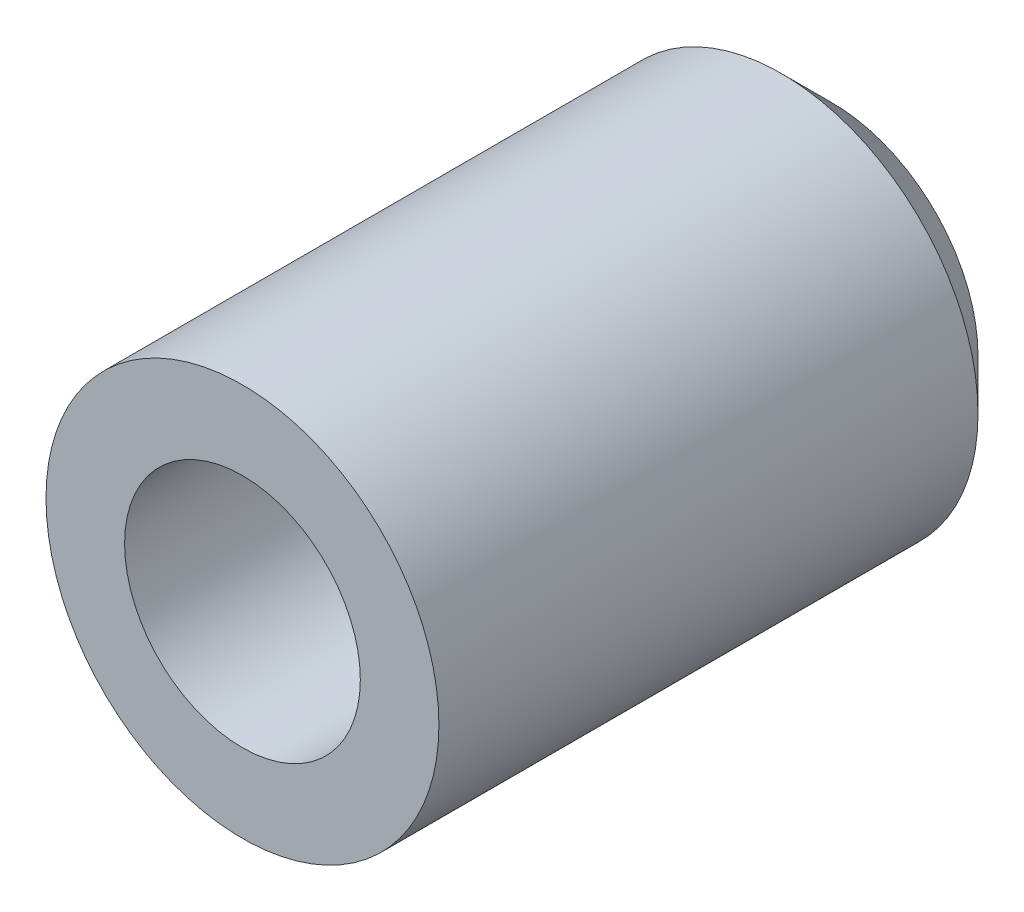
ISO-10303-21;
HEADER;
FILE_DESCRIPTION(('STEP AP214'),'2;1');
FILE_NAME('part.step','',(''),(''),'','','');
FILE_SCHEMA(('AUTOMOTIVE_DESIGN { 1 0 10303 214 1 1 1 1 }'));
ENDSEC;
DATA;
#1=APPLICATION_CONTEXT('core data for automotive mechanical design processes');
#2=APPLICATION_PROTOCOL_DEFINITION('international standard','automotive_design',2000,#1);
#3=PRODUCT_CONTEXT('',#1,'mechanical');
#4=PRODUCT('Part','Part','',(#3));
#5=PRODUCT_RELATED_PRODUCT_CATEGORY('part','',(#4));
#6=PRODUCT_DEFINITION_FORMATION('','',#4);
#7=PRODUCT_DEFINITION_CONTEXT('part definition',#1,'design');
#8=PRODUCT_DEFINITION('design','',#6,#7);
#9=PRODUCT_DEFINITION_SHAPE('','',#8);
#10=(LENGTH_UNIT() NAMED_UNIT(*) SI_UNIT(.MILLI.,.METRE.));
#11=(NAMED_UNIT(*) PLANE_ANGLE_UNIT() SI_UNIT($,.RADIAN.));
#12=(NAMED_UNIT(*) SI_UNIT($,.STERADIAN.) SOLID_ANGLE_UNIT());
#13=UNCERTAINTY_MEASURE_WITH_UNIT(LENGTH_MEASURE(1.E-05),#10,'distance_accuracy_value','');
#14=(GEOMETRIC_REPRESENTATION_CONTEXT(3) GLOBAL_UNCERTAINTY_ASSIGNED_CONTEXT((#13)) GLOBAL_UNIT_ASSIGNED_CONTEXT((#10,
#11,#12)) REPRESENTATION_CONTEXT('',''));
#15=CARTESIAN_POINT('',(0.,0.,0.));
#16=DIRECTION('',(0.,0.,1.));
#17=DIRECTION('',(1.,0.,0.));
#18=AXIS2_PLACEMENT_3D('',#15,#16,#17);
#19=CARTESIAN_POINT('',(0.,0.,11.90625));
#20=DIRECTION('',(0.,0.,1.));
#21=DIRECTION('',(1.,0.,0.));
#22=AXIS2_PLACEMENT_3D('',#19,#20,#21);
#23=PLANE('',#22);
#24=CARTESIAN_POINT('',(0.,0.,11.90625));
#25=DIRECTION('',(0.,0.,1.));
#26=DIRECTION('',(1.,0.,0.));
#27=AXIS2_PLACEMENT_3D('',#24,#25,#26);
#28=CIRCLE('',#27,7.9375);
#29=CARTESIAN_POINT('',(7.9375,0.,11.90625));
#30=VERTEX_POINT('',#29);
#31=EDGE_CURVE('E42',#30,#30,#28,.T.);
#32=ORIENTED_EDGE('',*,*,#31,.T.);
#33=EDGE_LOOP('',(#32));
#34=FACE_BOUND('',#33,.T.);
#35=CARTESIAN_POINT('',(0.,0.,11.90625));
#36=DIRECTION('',(0.,0.,1.));
#37=DIRECTION('',(1.,0.,0.));
#38=AXIS2_PLACEMENT_3D('',#35,#36,#37);
#39=CIRCLE('',#38,4.7625);
#40=CARTESIAN_POINT('',(4.7625,0.,11.90625));
#41=VERTEX_POINT('',#40);
#42=EDGE_CURVE('E46',#41,#41,#39,.T.);
#43=ORIENTED_EDGE('',*,*,#42,.F.);
#44=EDGE_LOOP('',(#43));
#45=FACE_BOUND('',#44,.T.);
#46=ADVANCED_FACE('F31',(#34,#45),#23,.T.);
#47=CARTESIAN_POINT('',(0.,0.,-11.90625));
#48=DIRECTION('',(0.,0.,1.));
#49=DIRECTION('',(1.,0.,0.));
#50=AXIS2_PLACEMENT_3D('',#47,#48,#49);
#51=PLANE('',#50);
#52=CARTESIAN_POINT('',(0.,0.,-11.90625));
#53=DIRECTION('',(0.,0.,1.));
#54=DIRECTION('',(1.,0.,0.));
#55=AXIS2_PLACEMENT_3D('',#52,#53,#54);
#56=CIRCLE('',#55,5.90549999999999);
#57=CARTESIAN_POINT('',(5.90549999999999,0.,-11.90625));
#58=VERTEX_POINT('',#57);
#59=EDGE_CURVE('E10',#58,#58,#56,.F.);
#60=ORIENTED_EDGE('',*,*,#59,.T.);
#61=EDGE_LOOP('',(#60));
#62=FACE_BOUND('',#61,.T.);
#63=CARTESIAN_POINT('',(0.,0.,-11.90625));
#64=DIRECTION('',(0.,0.,1.));
#65=DIRECTION('',(1.,0.,0.));
#66=AXIS2_PLACEMENT_3D('',#63,#64,#65);
#67=CIRCLE('',#66,4.7625);
#68=CARTESIAN_POINT('',(4.7625,0.,-11.90625));
#69=VERTEX_POINT('',#68);
#70=EDGE_CURVE('E49',#69,#69,#67,.T.);
#71=ORIENTED_EDGE('',*,*,#70,.T.);
#72=EDGE_LOOP('',(#71));
#73=FACE_BOUND('',#72,.T.);
#74=ADVANCED_FACE('F59',(#62,#73),#51,.F.);
#75=CARTESIAN_POINT('',(0.,0.,11.90625));
#76=DIRECTION('',(0.,0.,-1.));
#77=DIRECTION('',(-1.,0.,0.));
#78=AXIS2_PLACEMENT_3D('',#75,#76,#77);
#79=CYLINDRICAL_SURFACE('',#78,7.9375);
#80=CARTESIAN_POINT('',(0.,0.,-9.87425));
#81=DIRECTION('',(0.,0.,1.));
#82=DIRECTION('',(1.,0.,0.));
#83=AXIS2_PLACEMENT_3D('',#80,#81,#82);
#84=CIRCLE('',#83,7.9375);
#85=CARTESIAN_POINT('',(7.9375,0.,-9.87425));
#86=VERTEX_POINT('',#85);
#87=EDGE_CURVE('E38',#86,#86,#84,.T.);
#88=ORIENTED_EDGE('',*,*,#87,.T.);
#89=EDGE_LOOP('',(#88));
#90=FACE_BOUND('',#89,.T.);
#91=ORIENTED_EDGE('',*,*,#31,.F.);
#92=EDGE_LOOP('',(#91));
#93=FACE_BOUND('',#92,.T.);
#94=ADVANCED_FACE('F65',(#90,#93),#79,.T.);
#95=CARTESIAN_POINT('',(0.,0.,11.90625));
#96=DIRECTION('',(0.,0.,-1.));
#97=DIRECTION('',(-1.,0.,0.));
#98=AXIS2_PLACEMENT_3D('',#95,#96,#97);
#99=CYLINDRICAL_SURFACE('',#98,4.7625);
#100=ORIENTED_EDGE('',*,*,#42,.T.);
#101=EDGE_LOOP('',(#100));
#102=FACE_BOUND('',#101,.T.);
#103=ORIENTED_EDGE('',*,*,#70,.F.);
#104=EDGE_LOOP('',(#103));
#105=FACE_BOUND('',#104,.T.);
#106=ADVANCED_FACE('F55',(#102,#105),#99,.F.);
#107=CARTESIAN_POINT('',(0.,0.,-9.87425));
#108=DIRECTION('',(0.,0.,1.));
#109=DIRECTION('',(1.,0.,0.));
#110=AXIS2_PLACEMENT_3D('',#107,#108,#109);
#111=CONICAL_SURFACE('',#110,7.9375,0.78539816339745);
#112=ORIENTED_EDGE('',*,*,#59,.F.);
#113=EDGE_LOOP('',(#112));
#114=FACE_BOUND('',#113,.T.);
#115=ORIENTED_EDGE('',*,*,#87,.F.);
#116=EDGE_LOOP('',(#115));
#117=FACE_BOUND('',#116,.T.);
#118=ADVANCED_FACE('F33',(#114,#117),#111,.T.);
#119=CLOSED_SHELL('',(#46,#74,#94,#106,#118));
#120=MANIFOLD_SOLID_BREP('B2',#119);
#121=ADVANCED_BREP_SHAPE_REPRESENTATION('',(#18,#120),#14);
#122=SHAPE_DEFINITION_REPRESENTATION(#9,#121);
ENDSEC;
END-ISO-10303-21;
